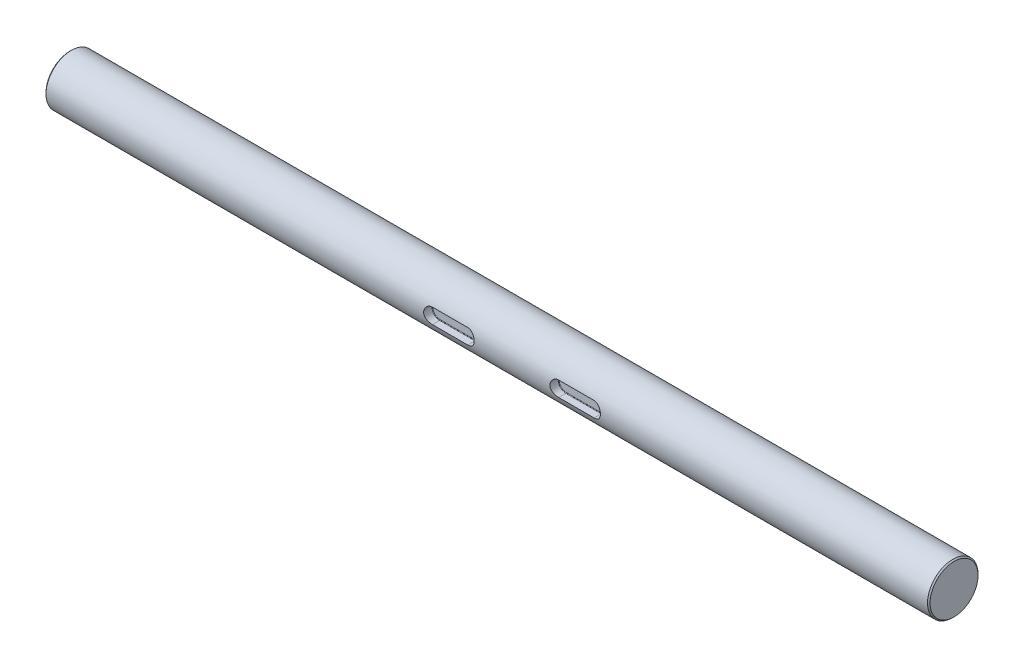
ISO-10303-21;
HEADER;
FILE_DESCRIPTION(('STEP AP214'),'2;1');
FILE_NAME('part.step','',(''),(''),'','','');
FILE_SCHEMA(('AUTOMOTIVE_DESIGN { 1 0 10303 214 1 1 1 1 }'));
ENDSEC;
DATA;
#1=APPLICATION_CONTEXT('core data for automotive mechanical design processes');
#2=APPLICATION_PROTOCOL_DEFINITION('international standard','automotive_design',2000,#1);
#3=PRODUCT_CONTEXT('',#1,'mechanical');
#4=PRODUCT('Part','Part','',(#3));
#5=PRODUCT_RELATED_PRODUCT_CATEGORY('part','',(#4));
#6=PRODUCT_DEFINITION_FORMATION('','',#4);
#7=PRODUCT_DEFINITION_CONTEXT('part definition',#1,'design');
#8=PRODUCT_DEFINITION('design','',#6,#7);
#9=PRODUCT_DEFINITION_SHAPE('','',#8);
#10=(LENGTH_UNIT() NAMED_UNIT(*) SI_UNIT(.MILLI.,.METRE.));
#11=(NAMED_UNIT(*) PLANE_ANGLE_UNIT() SI_UNIT($,.RADIAN.));
#12=(NAMED_UNIT(*) SI_UNIT($,.STERADIAN.) SOLID_ANGLE_UNIT());
#13=UNCERTAINTY_MEASURE_WITH_UNIT(LENGTH_MEASURE(1.E-05),#10,'distance_accuracy_value','');
#14=(GEOMETRIC_REPRESENTATION_CONTEXT(3) GLOBAL_UNCERTAINTY_ASSIGNED_CONTEXT((#13)) GLOBAL_UNIT_ASSIGNED_CONTEXT((#10,
#11,#12)) REPRESENTATION_CONTEXT('',''));
#15=CARTESIAN_POINT('',(0.,0.,0.));
#16=DIRECTION('',(0.,0.,1.));
#17=DIRECTION('',(1.,0.,0.));
#18=AXIS2_PLACEMENT_3D('',#15,#16,#17);
#19=CARTESIAN_POINT('',(0.,10.,0.));
#20=DIRECTION('',(1.,0.,0.));
#21=DIRECTION('',(0.,0.,-1.));
#22=AXIS2_PLACEMENT_3D('',#19,#20,#21);
#23=PLANE('',#22);
#24=CARTESIAN_POINT('',(0.,0.,0.));
#25=DIRECTION('',(1.,0.,0.));
#26=DIRECTION('',(0.,0.,-1.));
#27=AXIS2_PLACEMENT_3D('',#24,#25,#26);
#28=CIRCLE('',#27,9.49999999999998);
#29=CARTESIAN_POINT('',(0.,0.,-9.49999999999998));
#30=VERTEX_POINT('',#29);
#31=EDGE_CURVE('E205',#30,#30,#28,.F.);
#32=ORIENTED_EDGE('',*,*,#31,.T.);
#33=EDGE_LOOP('',(#32));
#34=FACE_BOUND('',#33,.T.);
#35=ADVANCED_FACE('F39',(#34),#23,.F.);
#36=CARTESIAN_POINT('',(350.,0.,0.));
#37=DIRECTION('',(-1.,0.,0.));
#38=DIRECTION('',(0.,0.,1.));
#39=AXIS2_PLACEMENT_3D('',#36,#37,#38);
#40=PLANE('',#39);
#41=CARTESIAN_POINT('',(350.,0.,0.));
#42=DIRECTION('',(-1.,0.,0.));
#43=DIRECTION('',(0.,0.,1.));
#44=AXIS2_PLACEMENT_3D('',#41,#42,#43);
#45=CIRCLE('',#44,9.49999999999998);
#46=CARTESIAN_POINT('',(350.,0.,9.49999999999998));
#47=VERTEX_POINT('',#46);
#48=EDGE_CURVE('E223',#47,#47,#45,.F.);
#49=ORIENTED_EDGE('',*,*,#48,.T.);
#50=EDGE_LOOP('',(#49));
#51=FACE_BOUND('',#50,.T.);
#52=ADVANCED_FACE('F277',(#51),#40,.F.);
#53=CARTESIAN_POINT('',(0.,0.,0.));
#54=DIRECTION('',(-1.,0.,0.));
#55=DIRECTION('',(0.,0.,1.));
#56=AXIS2_PLACEMENT_3D('',#53,#54,#55);
#57=CYLINDRICAL_SURFACE('',#56,9.99999999999999);
#58=DIRECTION('',(-1.,0.,0.));
#59=VECTOR('',#58,1.);
#60=CARTESIAN_POINT('',(0.,3.00000000000002,9.53939201416944));
#61=LINE('',#60,#59);
#62=CARTESIAN_POINT('',(203.,3.00000000000004,9.53939201416944));
#63=VERTEX_POINT('',#62);
#64=CARTESIAN_POINT('',(217.,3.00000000000002,9.53939201416944));
#65=VERTEX_POINT('',#64);
#66=EDGE_CURVE('E47',#63,#65,#61,.F.);
#67=ORIENTED_EDGE('',*,*,#66,.T.);
#68=CARTESIAN_POINT('',(217.,3.00000000000005,9.53939201416943));
#69=CARTESIAN_POINT('',(217.082335520823,3.00001027845732,9.53938054248204));
#70=CARTESIAN_POINT('',(217.164664455063,2.99661062684477,9.54045772064376));
#71=CARTESIAN_POINT('',(217.328693952765,2.98307142899352,9.54470412105984));
#72=CARTESIAN_POINT('',(217.410394653324,2.97293339805423,9.54787287296846));
#73=CARTESIAN_POINT('',(217.572384915673,2.9460314062505,9.55620668351001));
#74=CARTESIAN_POINT('',(217.652677524043,2.92928426957742,9.56136667250112));
#75=CARTESIAN_POINT('',(217.811475844134,2.88932853030399,9.57351626651176));
#76=CARTESIAN_POINT('',(217.889981509067,2.86611975872645,9.58050591937825));
#77=CARTESIAN_POINT('',(218.12194938799,2.78708584446028,9.60391637654134));
#78=CARTESIAN_POINT('',(218.272068438833,2.72181852542976,9.62279007830389));
#79=CARTESIAN_POINT('',(218.559226043979,2.56815043531279,9.66493213967817));
#80=CARTESIAN_POINT('',(218.696258470762,2.47973889924163,9.68820254290639));
#81=CARTESIAN_POINT('',(218.957722987948,2.27929879634446,9.73733650515373));
#82=CARTESIAN_POINT('',(219.081684874061,2.16666914746587,9.76325505469872));
#83=CARTESIAN_POINT('',(219.309273614839,1.92227736150436,9.81429628475076));
#84=CARTESIAN_POINT('',(219.412897033861,1.79051199848167,9.83941883019408));
#85=CARTESIAN_POINT('',(219.598926865095,1.50821997465699,9.88666477976533));
#86=CARTESIAN_POINT('',(219.680850179783,1.35736167401017,9.90871541546877));
#87=CARTESIAN_POINT('',(219.817977004003,1.04324233568303,9.94668940088143));
#88=CARTESIAN_POINT('',(219.873187403368,0.879984508687993,9.96261433032402));
#89=CARTESIAN_POINT('',(219.953759551791,0.550649404820611,9.98615279768397));
#90=CARTESIAN_POINT('',(219.979929703518,0.38478625301621,9.99399098526791));
#91=CARTESIAN_POINT('',(220.004234695146,0.0508471415689337,10.0012640407204));
#92=CARTESIAN_POINT('',(220.002374842678,-0.117228393125333,10.0007004995012));
#93=CARTESIAN_POINT('',(219.971214179309,-0.445143199271818,9.99139205125585));
#94=CARTESIAN_POINT('',(219.942789309192,-0.605074290763023,9.98290831016511));
#95=CARTESIAN_POINT('',(219.860736730374,-0.91778010437031,9.95903027401821));
#96=CARTESIAN_POINT('',(219.807107701317,-1.07055445110879,9.94363561692557));
#97=CARTESIAN_POINT('',(219.675575556475,-1.36669563173912,9.90730429851781));
#98=CARTESIAN_POINT('',(219.597396711224,-1.50993201207613,9.88630511384914));
#99=CARTESIAN_POINT('',(219.419202819966,-1.781531059161,9.84099249303646));
#100=CARTESIAN_POINT('',(219.319182881059,-1.90989038323251,9.81667831471805));
#101=CARTESIAN_POINT('',(219.095616023815,-2.15330901082205,9.76623347142779));
#102=CARTESIAN_POINT('',(218.971312272474,-2.26766702955975,9.74006890899096));
#103=CARTESIAN_POINT('',(218.705005153149,-2.47413538985067,9.68968430229326));
#104=CARTESIAN_POINT('',(218.56299663927,-2.5662392402618,9.66546482675133));
#105=CARTESIAN_POINT('',(218.2634381431,-2.72632814481701,9.62154457591302));
#106=CARTESIAN_POINT('',(218.105745640813,-2.79406012682262,9.60189192491895));
#107=CARTESIAN_POINT('',(217.780550992037,-2.90171772009404,9.56991327306402));
#108=CARTESIAN_POINT('',(217.613064278571,-2.94168586436072,9.55757606951749));
#109=CARTESIAN_POINT('',(217.37001022186,-2.97802407180158,9.54628064650011));
#110=CARTESIAN_POINT('',(217.296218531641,-2.98626405978017,9.54370312550533));
#111=CARTESIAN_POINT('',(217.148297041801,-2.99724711229708,9.54025857223563));
#112=CARTESIAN_POINT('',(217.074167900672,-2.99999825936537,9.53938902493287));
#113=CARTESIAN_POINT('',(217.,-3.,9.53939201416945));
#114=B_SPLINE_CURVE_WITH_KNOTS('',3,(#68,#69,#70,#71,#72,#73,#74,#75,#76,#77,#78,#79,#80,#81,
#82,#83,#84,#85,#86,#87,#88,#89,#90,#91,#92,#93,#94,#95,#96,#97,#98,#99,#100,#101,#102,#103,
#104,#105,#106,#107,#108,#109,#110,#111,#112,#113),.UNSPECIFIED.,.F.,.F.,(4,2,2,2,2,2,2,2,2,2,2,
2,2,2,2,2,2,2,2,2,2,2,4),(0.,0.246918142439474,0.49378077770608,0.740019009623012,
0.986263681482041,1.47813347402029,1.97023245590781,2.4763511982277,2.98255536239036,
3.49922810620076,4.01576751791677,4.51753600864769,5.01920948804106,5.50490358251098,
5.99062312360837,6.48200583350627,6.97349873739176,7.48389234847129,7.99443465298723,
8.51013494368219,9.02504345105582,9.24774267716781,9.47011372732398),.UNSPECIFIED.);
#115=CARTESIAN_POINT('',(217.,-2.99999999999999,9.53939201416944));
#116=VERTEX_POINT('',#115);
#117=EDGE_CURVE('E54',#65,#116,#114,.T.);
#118=ORIENTED_EDGE('',*,*,#117,.T.);
#119=DIRECTION('',(-1.,0.,0.));
#120=VECTOR('',#119,1.);
#121=CARTESIAN_POINT('',(0.,-3.00000000000002,9.53939201416944));
#122=LINE('',#121,#120);
#123=CARTESIAN_POINT('',(203.,-3.,9.53939201416944));
#124=VERTEX_POINT('',#123);
#125=EDGE_CURVE('E11',#116,#124,#122,.T.);
#126=ORIENTED_EDGE('',*,*,#125,.T.);
#127=CARTESIAN_POINT('',(203.,-3.,9.53939201416945));
#128=CARTESIAN_POINT('',(202.917664479177,-3.00001027845728,9.53938054248206));
#129=CARTESIAN_POINT('',(202.835335544937,-2.99661062684472,9.54045772064377));
#130=CARTESIAN_POINT('',(202.671306047235,-2.98307142899347,9.54470412105985));
#131=CARTESIAN_POINT('',(202.589605346676,-2.97293339805418,9.54787287296848));
#132=CARTESIAN_POINT('',(202.427615084327,-2.94603140625045,9.55620668351002));
#133=CARTESIAN_POINT('',(202.347322475957,-2.92928426957737,9.56136667250114));
#134=CARTESIAN_POINT('',(202.188524155866,-2.88932853030395,9.57351626651177));
#135=CARTESIAN_POINT('',(202.110018490933,-2.8661197587264,9.58050591937827));
#136=CARTESIAN_POINT('',(201.87805061201,-2.78708584446023,9.60391637654136));
#137=CARTESIAN_POINT('',(201.727931561167,-2.72181852542971,9.6227900783039));
#138=CARTESIAN_POINT('',(201.440773956021,-2.56815043531274,9.66493213967819));
#139=CARTESIAN_POINT('',(201.303741529238,-2.47973889924158,9.6882025429064));
#140=CARTESIAN_POINT('',(201.042277012052,-2.27929879634441,9.73733650515374));
#141=CARTESIAN_POINT('',(200.918315125939,-2.16666914746582,9.76325505469873));
#142=CARTESIAN_POINT('',(200.690726385161,-1.92227736150431,9.81429628475076));
#143=CARTESIAN_POINT('',(200.587102966139,-1.79051199848162,9.83941883019409));
#144=CARTESIAN_POINT('',(200.401073134905,-1.50821997465694,9.88666477976534));
#145=CARTESIAN_POINT('',(200.319149820217,-1.35736167401012,9.90871541546877));
#146=CARTESIAN_POINT('',(200.182022995997,-1.04324233568298,9.94668940088144));
#147=CARTESIAN_POINT('',(200.126812596632,-0.879984508687945,9.96261433032402));
#148=CARTESIAN_POINT('',(200.046240448209,-0.550649404820562,9.98615279768397));
#149=CARTESIAN_POINT('',(200.020070296482,-0.384786253016162,9.99399098526791));
#150=CARTESIAN_POINT('',(199.995765304854,-0.0508471415688855,10.0012640407204));
#151=CARTESIAN_POINT('',(199.997625157322,0.117228393125381,10.0007004995012));
#152=CARTESIAN_POINT('',(200.028785820691,0.445143199271866,9.99139205125585));
#153=CARTESIAN_POINT('',(200.057210690808,0.60507429076307,9.98290831016511));
#154=CARTESIAN_POINT('',(200.139263269626,0.917780104370356,9.95903027401821));
#155=CARTESIAN_POINT('',(200.192892298683,1.07055445110883,9.94363561692557));
#156=CARTESIAN_POINT('',(200.324424443525,1.36669563173916,9.9073042985178));
#157=CARTESIAN_POINT('',(200.402603288776,1.50993201207617,9.88630511384913));
#158=CARTESIAN_POINT('',(200.580797180034,1.78153105916105,9.84099249303645));
#159=CARTESIAN_POINT('',(200.680817118941,1.90989038323255,9.81667831471804));
#160=CARTESIAN_POINT('',(200.904383976185,2.1533090108221,9.76623347142778));
#161=CARTESIAN_POINT('',(201.028687727526,2.2676670295598,9.74006890899095));
#162=CARTESIAN_POINT('',(201.294994846851,2.47413538985072,9.68968430229325));
#163=CARTESIAN_POINT('',(201.43700336073,2.56623924026185,9.66546482675131));
#164=CARTESIAN_POINT('',(201.7365618569,2.72632814481706,9.62154457591301));
#165=CARTESIAN_POINT('',(201.894254359187,2.79406012682267,9.60189192491893));
#166=CARTESIAN_POINT('',(202.219449007963,2.90171772009409,9.569913273064));
#167=CARTESIAN_POINT('',(202.386935721429,2.94168586436077,9.55757606951747));
#168=CARTESIAN_POINT('',(202.62998977814,2.97802407180163,9.54628064650009));
#169=CARTESIAN_POINT('',(202.703781468359,2.98626405978022,9.54370312550531));
#170=CARTESIAN_POINT('',(202.851702958199,2.99724711229713,9.54025857223562));
#171=CARTESIAN_POINT('',(202.925832099328,2.99999825936542,9.53938902493285));
#172=CARTESIAN_POINT('',(203.,3.00000000000005,9.53939201416943));
#173=B_SPLINE_CURVE_WITH_KNOTS('',3,(#127,#128,#129,#130,#131,#132,#133,#134,#135,#136,#137,
#138,#139,#140,#141,#142,#143,#144,#145,#146,#147,#148,#149,#150,#151,#152,#153,#154,#155,#156,
#157,#158,#159,#160,#161,#162,#163,#164,#165,#166,#167,#168,#169,#170,#171,#172),.UNSPECIFIED.,
.F.,.F.,(4,2,2,2,2,2,2,2,2,2,2,2,2,2,2,2,2,2,2,2,2,2,4),(0.,0.246918142439474,0.49378077770608,
0.740019009623012,0.986263681482041,1.47813347402029,1.97023245590781,2.4763511982277,
2.98255536239036,3.49922810620076,4.01576751791677,4.51753600864769,5.01920948804106,
5.50490358251098,5.99062312360837,6.48200583350627,6.97349873739176,7.48389234847129,
7.99443465298722,8.51013494368219,9.02504345105582,9.24774267716787,9.47011372732398),.UNSPECIFIED.);
#174=EDGE_CURVE('E311',#124,#63,#173,.T.);
#175=ORIENTED_EDGE('',*,*,#174,.T.);
#176=EDGE_LOOP('',(#67,#118,#126,#175));
#177=FACE_BOUND('',#176,.T.);
#178=DIRECTION('',(-1.,0.,0.));
#179=VECTOR('',#178,1.);
#180=CARTESIAN_POINT('',(0.,2.99999999999998,9.53939201416945));
#181=LINE('',#180,#179);
#182=CARTESIAN_POINT('',(153.,3.,9.53939201416945));
#183=VERTEX_POINT('',#182);
#184=CARTESIAN_POINT('',(167.,2.99999999999998,9.53939201416945));
#185=VERTEX_POINT('',#184);
#186=EDGE_CURVE('E306',#183,#185,#181,.F.);
#187=ORIENTED_EDGE('',*,*,#186,.T.);
#188=CARTESIAN_POINT('',(167.,3.,9.53939201416945));
#189=CARTESIAN_POINT('',(167.082335520823,3.00001027845728,9.53938054248206));
#190=CARTESIAN_POINT('',(167.164664455063,2.99661062684472,9.54045772064378));
#191=CARTESIAN_POINT('',(167.328693952765,2.98307142899347,9.54470412105985));
#192=CARTESIAN_POINT('',(167.410394653324,2.97293339805418,9.54787287296848));
#193=CARTESIAN_POINT('',(167.572384915673,2.94603140625045,9.55620668351002));
#194=CARTESIAN_POINT('',(167.652677524043,2.92928426957737,9.56136667250113));
#195=CARTESIAN_POINT('',(167.811475844134,2.88932853030395,9.57351626651177));
#196=CARTESIAN_POINT('',(167.889981509067,2.86611975872641,9.58050591937826));
#197=CARTESIAN_POINT('',(168.12194938799,2.78708584446025,9.60391637654135));
#198=CARTESIAN_POINT('',(168.272068438833,2.72181852542973,9.6227900783039));
#199=CARTESIAN_POINT('',(168.559226043979,2.56815043531277,9.66493213967818));
#200=CARTESIAN_POINT('',(168.696258470762,2.4797388992416,9.6882025429064));
#201=CARTESIAN_POINT('',(168.957722987948,2.27929879634443,9.73733650515373));
#202=CARTESIAN_POINT('',(169.081684874061,2.16666914746584,9.76325505469873));
#203=CARTESIAN_POINT('',(169.309273614839,1.92227736150433,9.81429628475076));
#204=CARTESIAN_POINT('',(169.412897033861,1.79051199848164,9.83941883019409));
#205=CARTESIAN_POINT('',(169.598926865095,1.50821997465697,9.88666477976533));
#206=CARTESIAN_POINT('',(169.680850179783,1.35736167401016,9.90871541546877));
#207=CARTESIAN_POINT('',(169.817977004003,1.04324233568303,9.94668940088143));
#208=CARTESIAN_POINT('',(169.873187403368,0.879984508687987,9.96261433032402));
#209=CARTESIAN_POINT('',(169.953759551791,0.550649404820607,9.98615279768397));
#210=CARTESIAN_POINT('',(169.979929703518,0.384786253016208,9.99399098526791));
#211=CARTESIAN_POINT('',(170.004234695146,0.0508471415689356,10.0012640407204));
#212=CARTESIAN_POINT('',(170.002374842678,-0.117228393125329,10.0007004995012));
#213=CARTESIAN_POINT('',(169.971214179309,-0.445143199271811,9.99139205125585));
#214=CARTESIAN_POINT('',(169.942789309192,-0.605074290763014,9.98290831016511));
#215=CARTESIAN_POINT('',(169.860736730374,-0.917780104370299,9.95903027401822));
#216=CARTESIAN_POINT('',(169.807107701317,-1.07055445110878,9.94363561692557));
#217=CARTESIAN_POINT('',(169.675575556475,-1.3666956317391,9.90730429851781));
#218=CARTESIAN_POINT('',(169.597396711224,-1.50993201207611,9.88630511384914));
#219=CARTESIAN_POINT('',(169.419202819966,-1.78153105916099,9.84099249303646));
#220=CARTESIAN_POINT('',(169.319182881059,-1.90989038323249,9.81667831471805));
#221=CARTESIAN_POINT('',(169.095616023815,-2.15330901082204,9.76623347142779));
#222=CARTESIAN_POINT('',(168.971312272474,-2.26766702955975,9.74006890899096));
#223=CARTESIAN_POINT('',(168.705005153149,-2.47413538985067,9.68968430229326));
#224=CARTESIAN_POINT('',(168.56299663927,-2.5662392402618,9.66546482675133));
#225=CARTESIAN_POINT('',(168.2634381431,-2.72632814481701,9.62154457591302));
#226=CARTESIAN_POINT('',(168.105745640813,-2.79406012682262,9.60189192491895));
#227=CARTESIAN_POINT('',(167.780550992037,-2.90171772009404,9.56991327306402));
#228=CARTESIAN_POINT('',(167.613064278571,-2.94168586436072,9.55757606951749));
#229=CARTESIAN_POINT('',(167.37001022186,-2.97802407180158,9.54628064650011));
#230=CARTESIAN_POINT('',(167.296218531641,-2.98626405978017,9.54370312550533));
#231=CARTESIAN_POINT('',(167.148297041801,-2.99724711229708,9.54025857223563));
#232=CARTESIAN_POINT('',(167.074167900672,-2.99999825936538,9.53938902493287));
#233=CARTESIAN_POINT('',(167.,-3.,9.53939201416945));
#234=B_SPLINE_CURVE_WITH_KNOTS('',3,(#188,#189,#190,#191,#192,#193,#194,#195,#196,#197,#198,
#199,#200,#201,#202,#203,#204,#205,#206,#207,#208,#209,#210,#211,#212,#213,#214,#215,#216,#217,
#218,#219,#220,#221,#222,#223,#224,#225,#226,#227,#228,#229,#230,#231,#232,#233),.UNSPECIFIED.,
.F.,.F.,(4,2,2,2,2,2,2,2,2,2,2,2,2,2,2,2,2,2,2,2,2,2,4),(0.,0.246918142439474,0.49378077770608,
0.740019009623012,0.986263681482012,1.47813347402023,1.97023245590778,2.47635119822767,
2.98255536239032,3.4992281062007,4.01576751791672,4.51753600864763,5.019209488041,
5.5049035825109,5.9906231236083,6.48200583350619,6.97349873739168,7.48389234847122,
7.99443465298715,8.51013494368212,9.02504345105572,9.24774267716774,9.47011372732391),.UNSPECIFIED.);
#235=CARTESIAN_POINT('',(167.,-3.,9.53939201416944));
#236=VERTEX_POINT('',#235);
#237=EDGE_CURVE('E62',#185,#236,#234,.T.);
#238=ORIENTED_EDGE('',*,*,#237,.T.);
#239=DIRECTION('',(-1.,0.,0.));
#240=VECTOR('',#239,1.);
#241=CARTESIAN_POINT('',(0.,-3.00000000000002,9.53939201416944));
#242=LINE('',#241,#240);
#243=CARTESIAN_POINT('',(153.,-3.,9.53939201416944));
#244=VERTEX_POINT('',#243);
#245=EDGE_CURVE('E310',#236,#244,#242,.T.);
#246=ORIENTED_EDGE('',*,*,#245,.T.);
#247=CARTESIAN_POINT('',(153.,-3.,9.53939201416945));
#248=CARTESIAN_POINT('',(152.917664479177,-3.00001027845728,9.53938054248206));
#249=CARTESIAN_POINT('',(152.835335544937,-2.99661062684473,9.54045772064377));
#250=CARTESIAN_POINT('',(152.671306047235,-2.98307142899347,9.54470412105985));
#251=CARTESIAN_POINT('',(152.589605346676,-2.97293339805419,9.54787287296848));
#252=CARTESIAN_POINT('',(152.427615084327,-2.94603140625045,9.55620668351002));
#253=CARTESIAN_POINT('',(152.347322475957,-2.92928426957738,9.56136667250113));
#254=CARTESIAN_POINT('',(152.188524155866,-2.88932853030395,9.57351626651177));
#255=CARTESIAN_POINT('',(152.110018490933,-2.86611975872641,9.58050591937826));
#256=CARTESIAN_POINT('',(151.87805061201,-2.78708584446025,9.60391637654135));
#257=CARTESIAN_POINT('',(151.727931561167,-2.72181852542973,9.62279007830389));
#258=CARTESIAN_POINT('',(151.440773956021,-2.56815043531277,9.66493213967818));
#259=CARTESIAN_POINT('',(151.303741529238,-2.47973889924161,9.6882025429064));
#260=CARTESIAN_POINT('',(151.042277012052,-2.27929879634443,9.73733650515373));
#261=CARTESIAN_POINT('',(150.918315125939,-2.16666914746584,9.76325505469872));
#262=CARTESIAN_POINT('',(150.690726385161,-1.92227736150434,9.81429628475076));
#263=CARTESIAN_POINT('',(150.587102966139,-1.79051199848164,9.83941883019409));
#264=CARTESIAN_POINT('',(150.401073134905,-1.50821997465698,9.88666477976533));
#265=CARTESIAN_POINT('',(150.319149820217,-1.35736167401016,9.90871541546877));
#266=CARTESIAN_POINT('',(150.182022995997,-1.04324233568303,9.94668940088143));
#267=CARTESIAN_POINT('',(150.126812596632,-0.87998450868799,9.96261433032402));
#268=CARTESIAN_POINT('',(150.046240448209,-0.550649404820608,9.98615279768397));
#269=CARTESIAN_POINT('',(150.020070296482,-0.384786253016209,9.99399098526791));
#270=CARTESIAN_POINT('',(149.995765304854,-0.0508471415689361,10.0012640407204));
#271=CARTESIAN_POINT('',(149.997625157322,0.117228393125328,10.0007004995012));
#272=CARTESIAN_POINT('',(150.028785820691,0.445143199271809,9.99139205125585));
#273=CARTESIAN_POINT('',(150.057210690808,0.605074290763012,9.98290831016511));
#274=CARTESIAN_POINT('',(150.139263269625,0.917780104370297,9.95903027401822));
#275=CARTESIAN_POINT('',(150.192892298683,1.07055445110877,9.94363561692557));
#276=CARTESIAN_POINT('',(150.324424443525,1.3666956317391,9.90730429851781));
#277=CARTESIAN_POINT('',(150.402603288776,1.50993201207611,9.88630511384914));
#278=CARTESIAN_POINT('',(150.580797180034,1.78153105916099,9.84099249303646));
#279=CARTESIAN_POINT('',(150.680817118941,1.90989038323249,9.81667831471805));
#280=CARTESIAN_POINT('',(150.904383976185,2.15330901082204,9.76623347142779));
#281=CARTESIAN_POINT('',(151.028687727526,2.26766702955974,9.74006890899096));
#282=CARTESIAN_POINT('',(151.294994846851,2.47413538985066,9.68968430229326));
#283=CARTESIAN_POINT('',(151.43700336073,2.5662392402618,9.66546482675133));
#284=CARTESIAN_POINT('',(151.7365618569,2.72632814481701,9.62154457591302));
#285=CARTESIAN_POINT('',(151.894254359187,2.79406012682262,9.60189192491895));
#286=CARTESIAN_POINT('',(152.219449007963,2.90171772009404,9.56991327306402));
#287=CARTESIAN_POINT('',(152.386935721429,2.94168586436072,9.55757606951749));
#288=CARTESIAN_POINT('',(152.62998977814,2.97802407180158,9.54628064650011));
#289=CARTESIAN_POINT('',(152.703781468359,2.98626405978017,9.54370312550532));
#290=CARTESIAN_POINT('',(152.851702958199,2.99724711229708,9.54025857223563));
#291=CARTESIAN_POINT('',(152.925832099328,2.99999825936537,9.53938902493287));
#292=CARTESIAN_POINT('',(153.,3.,9.53939201416945));
#293=B_SPLINE_CURVE_WITH_KNOTS('',3,(#247,#248,#249,#250,#251,#252,#253,#254,#255,#256,#257,
#258,#259,#260,#261,#262,#263,#264,#265,#266,#267,#268,#269,#270,#271,#272,#273,#274,#275,#276,
#277,#278,#279,#280,#281,#282,#283,#284,#285,#286,#287,#288,#289,#290,#291,#292),.UNSPECIFIED.,
.F.,.F.,(4,2,2,2,2,2,2,2,2,2,2,2,2,2,2,2,2,2,2,2,2,2,4),(0.,0.246918142439474,0.49378077770608,
0.740019009622984,0.986263681482012,1.47813347402023,1.97023245590778,2.47635119822767,
2.98255536239032,3.4992281062007,4.01576751791672,4.51753600864763,5.019209488041,
5.50490358251091,5.9906231236083,6.48200583350619,6.97349873739168,7.48389234847122,
7.99443465298715,8.51013494368212,9.02504345105572,9.2477426771678,9.47011372732391),.UNSPECIFIED.);
#294=EDGE_CURVE('E226',#244,#183,#293,.T.);
#295=ORIENTED_EDGE('',*,*,#294,.T.);
#296=EDGE_LOOP('',(#187,#238,#246,#295));
#297=FACE_BOUND('',#296,.T.);
#298=CARTESIAN_POINT('',(0.500000000000018,0.,0.));
#299=DIRECTION('',(1.,0.,0.));
#300=DIRECTION('',(0.,0.,-1.));
#301=AXIS2_PLACEMENT_3D('',#298,#299,#300);
#302=CIRCLE('',#301,9.99999999999999);
#303=CARTESIAN_POINT('',(0.500000000000018,0.,-9.99999999999999));
#304=VERTEX_POINT('',#303);
#305=EDGE_CURVE('E220',#304,#304,#302,.T.);
#306=ORIENTED_EDGE('',*,*,#305,.T.);
#307=EDGE_LOOP('',(#306));
#308=FACE_BOUND('',#307,.T.);
#309=CARTESIAN_POINT('',(349.5,0.,0.));
#310=DIRECTION('',(-1.,0.,0.));
#311=DIRECTION('',(0.,0.,1.));
#312=AXIS2_PLACEMENT_3D('',#309,#310,#311);
#313=CIRCLE('',#312,9.99999999999999);
#314=CARTESIAN_POINT('',(349.5,0.,9.99999999999999));
#315=VERTEX_POINT('',#314);
#316=EDGE_CURVE('E217',#315,#315,#313,.T.);
#317=ORIENTED_EDGE('',*,*,#316,.T.);
#318=EDGE_LOOP('',(#317));
#319=FACE_BOUND('',#318,.T.);
#320=ADVANCED_FACE('F239',(#177,#297,#308,#319),#57,.T.);
#321=CARTESIAN_POINT('',(0.,0.,0.));
#322=DIRECTION('',(1.,0.,0.));
#323=DIRECTION('',(0.,0.,-1.));
#324=AXIS2_PLACEMENT_3D('',#321,#322,#323);
#325=CONICAL_SURFACE('',#324,9.49999999999998,0.785398163397441);
#326=ORIENTED_EDGE('',*,*,#305,.F.);
#327=EDGE_LOOP('',(#326));
#328=FACE_BOUND('',#327,.T.);
#329=ORIENTED_EDGE('',*,*,#31,.F.);
#330=EDGE_LOOP('',(#329));
#331=FACE_BOUND('',#330,.T.);
#332=ADVANCED_FACE('F284',(#328,#331),#325,.T.);
#333=CARTESIAN_POINT('',(349.5,0.,0.));
#334=DIRECTION('',(-1.,0.,0.));
#335=DIRECTION('',(0.,0.,1.));
#336=AXIS2_PLACEMENT_3D('',#333,#334,#335);
#337=CONICAL_SURFACE('',#336,9.99999999999999,0.785398163397403);
#338=ORIENTED_EDGE('',*,*,#48,.F.);
#339=EDGE_LOOP('',(#338));
#340=FACE_BOUND('',#339,.T.);
#341=ORIENTED_EDGE('',*,*,#316,.F.);
#342=EDGE_LOOP('',(#341));
#343=FACE_BOUND('',#342,.T.);
#344=ADVANCED_FACE('F41',(#340,#343),#337,.T.);
#345=CARTESIAN_POINT('',(167.,0.,10.));
#346=DIRECTION('',(0.,0.,1.));
#347=DIRECTION('',(1.,0.,0.));
#348=AXIS2_PLACEMENT_3D('',#345,#346,#347);
#349=CYLINDRICAL_SURFACE('',#348,3.);
#350=DIRECTION('',(0.,0.,1.));
#351=VECTOR('',#350,1.);
#352=CARTESIAN_POINT('',(167.,3.,6.5));
#353=LINE('',#352,#351);
#354=CARTESIAN_POINT('',(167.,3.,6.7));
#355=VERTEX_POINT('',#354);
#356=EDGE_CURVE('E182',#185,#355,#353,.F.);
#357=ORIENTED_EDGE('',*,*,#356,.T.);
#358=CARTESIAN_POINT('',(167.,0.,6.7));
#359=DIRECTION('',(0.,0.,-1.));
#360=DIRECTION('',(-1.,0.,0.));
#361=AXIS2_PLACEMENT_3D('',#358,#359,#360);
#362=CIRCLE('',#361,3.);
#363=CARTESIAN_POINT('',(167.,-3.,6.7));
#364=VERTEX_POINT('',#363);
#365=EDGE_CURVE('E200',#364,#355,#362,.F.);
#366=ORIENTED_EDGE('',*,*,#365,.F.);
#367=DIRECTION('',(0.,0.,1.));
#368=VECTOR('',#367,1.);
#369=CARTESIAN_POINT('',(167.,-3.,6.5));
#370=LINE('',#369,#368);
#371=EDGE_CURVE('E184',#364,#236,#370,.T.);
#372=ORIENTED_EDGE('',*,*,#371,.T.);
#373=ORIENTED_EDGE('',*,*,#237,.F.);
#374=EDGE_LOOP('',(#357,#366,#372,#373));
#375=FACE_BOUND('',#374,.T.);
#376=ADVANCED_FACE('F248',(#375),#349,.F.);
#377=CARTESIAN_POINT('',(153.,0.,6.5));
#378=DIRECTION('',(0.,0.,1.));
#379=DIRECTION('',(1.,0.,0.));
#380=AXIS2_PLACEMENT_3D('',#377,#378,#379);
#381=CYLINDRICAL_SURFACE('',#380,3.);
#382=DIRECTION('',(0.,0.,1.));
#383=VECTOR('',#382,1.);
#384=CARTESIAN_POINT('',(153.,-3.,6.5));
#385=LINE('',#384,#383);
#386=CARTESIAN_POINT('',(153.,-3.,6.7));
#387=VERTEX_POINT('',#386);
#388=EDGE_CURVE('E179',#244,#387,#385,.F.);
#389=ORIENTED_EDGE('',*,*,#388,.T.);
#390=CARTESIAN_POINT('',(153.,0.,6.7));
#391=DIRECTION('',(0.,0.,-1.));
#392=DIRECTION('',(-1.,0.,0.));
#393=AXIS2_PLACEMENT_3D('',#390,#391,#392);
#394=CIRCLE('',#393,3.);
#395=CARTESIAN_POINT('',(153.,3.,6.7));
#396=VERTEX_POINT('',#395);
#397=EDGE_CURVE('E195',#396,#387,#394,.F.);
#398=ORIENTED_EDGE('',*,*,#397,.F.);
#399=DIRECTION('',(0.,0.,1.));
#400=VECTOR('',#399,1.);
#401=CARTESIAN_POINT('',(153.,3.,6.5));
#402=LINE('',#401,#400);
#403=EDGE_CURVE('E176',#396,#183,#402,.T.);
#404=ORIENTED_EDGE('',*,*,#403,.T.);
#405=ORIENTED_EDGE('',*,*,#294,.F.);
#406=EDGE_LOOP('',(#389,#398,#404,#405));
#407=FACE_BOUND('',#406,.T.);
#408=ADVANCED_FACE('F243',(#407),#381,.F.);
#409=CARTESIAN_POINT('',(150.,-3.,6.5));
#410=DIRECTION('',(0.,-1.,0.));
#411=DIRECTION('',(1.,0.,0.));
#412=AXIS2_PLACEMENT_3D('',#409,#410,#411);
#413=PLANE('',#412);
#414=ORIENTED_EDGE('',*,*,#371,.F.);
#415=DIRECTION('',(1.,0.,0.));
#416=VECTOR('',#415,1.);
#417=CARTESIAN_POINT('',(150.,-3.,6.7));
#418=LINE('',#417,#416);
#419=EDGE_CURVE('E198',#387,#364,#418,.T.);
#420=ORIENTED_EDGE('',*,*,#419,.F.);
#421=ORIENTED_EDGE('',*,*,#388,.F.);
#422=ORIENTED_EDGE('',*,*,#245,.F.);
#423=EDGE_LOOP('',(#414,#420,#421,#422));
#424=FACE_BOUND('',#423,.T.);
#425=ADVANCED_FACE('F247',(#424),#413,.F.);
#426=CARTESIAN_POINT('',(150.,2.99999999999999,6.5));
#427=DIRECTION('',(0.,1.,0.));
#428=DIRECTION('',(-1.,0.,0.));
#429=AXIS2_PLACEMENT_3D('',#426,#427,#428);
#430=PLANE('',#429);
#431=ORIENTED_EDGE('',*,*,#403,.F.);
#432=DIRECTION('',(-1.,0.,0.));
#433=VECTOR('',#432,1.);
#434=CARTESIAN_POINT('',(150.,2.99999999999999,6.7));
#435=LINE('',#434,#433);
#436=EDGE_CURVE('E203',#355,#396,#435,.T.);
#437=ORIENTED_EDGE('',*,*,#436,.F.);
#438=ORIENTED_EDGE('',*,*,#356,.F.);
#439=ORIENTED_EDGE('',*,*,#186,.F.);
#440=EDGE_LOOP('',(#431,#437,#438,#439));
#441=FACE_BOUND('',#440,.T.);
#442=ADVANCED_FACE('F273',(#441),#430,.F.);
#443=CARTESIAN_POINT('',(0.,0.,6.5));
#444=DIRECTION('',(0.,0.,-1.));
#445=DIRECTION('',(-1.,0.,0.));
#446=AXIS2_PLACEMENT_3D('',#443,#444,#445);
#447=PLANE('',#446);
#448=DIRECTION('',(1.,0.,0.));
#449=VECTOR('',#448,1.);
#450=CARTESIAN_POINT('',(0.,-2.80000000000002,6.5));
#451=LINE('',#450,#449);
#452=CARTESIAN_POINT('',(167.,-2.8,6.5));
#453=VERTEX_POINT('',#452);
#454=CARTESIAN_POINT('',(153.,-2.8,6.5));
#455=VERTEX_POINT('',#454);
#456=EDGE_CURVE('E190',#453,#455,#451,.F.);
#457=ORIENTED_EDGE('',*,*,#456,.F.);
#458=CARTESIAN_POINT('',(167.,0.,6.5));
#459=DIRECTION('',(0.,0.,-1.));
#460=DIRECTION('',(-1.,0.,0.));
#461=AXIS2_PLACEMENT_3D('',#458,#459,#460);
#462=CIRCLE('',#461,2.8);
#463=CARTESIAN_POINT('',(167.,2.8,6.5));
#464=VERTEX_POINT('',#463);
#465=EDGE_CURVE('E188',#464,#453,#462,.T.);
#466=ORIENTED_EDGE('',*,*,#465,.F.);
#467=DIRECTION('',(-1.,0.,0.));
#468=VECTOR('',#467,1.);
#469=CARTESIAN_POINT('',(0.,2.79999999999998,6.5));
#470=LINE('',#469,#468);
#471=CARTESIAN_POINT('',(153.,2.8,6.5));
#472=VERTEX_POINT('',#471);
#473=EDGE_CURVE('E186',#472,#464,#470,.F.);
#474=ORIENTED_EDGE('',*,*,#473,.F.);
#475=CARTESIAN_POINT('',(153.,0.,6.5));
#476=DIRECTION('',(0.,0.,-1.));
#477=DIRECTION('',(-1.,0.,0.));
#478=AXIS2_PLACEMENT_3D('',#475,#476,#477);
#479=CIRCLE('',#478,2.8);
#480=EDGE_CURVE('E192',#455,#472,#479,.T.);
#481=ORIENTED_EDGE('',*,*,#480,.F.);
#482=EDGE_LOOP('',(#457,#466,#474,#481));
#483=FACE_BOUND('',#482,.T.);
#484=ADVANCED_FACE('F268',(#483),#447,.F.);
#485=CARTESIAN_POINT('',(167.,0.,6.7));
#486=DIRECTION('',(0.,0.,-1.));
#487=DIRECTION('',(-1.,0.,0.));
#488=AXIS2_PLACEMENT_3D('',#485,#486,#487);
#489=TOROIDAL_SURFACE('',#488,2.8,0.2);
#490=CARTESIAN_POINT('',(167.,2.8,6.7));
#491=DIRECTION('',(-1.,0.,0.));
#492=DIRECTION('',(0.,0.,1.));
#493=AXIS2_PLACEMENT_3D('',#490,#491,#492);
#494=CIRCLE('',#493,0.2);
#495=EDGE_CURVE('E210',#355,#464,#494,.T.);
#496=ORIENTED_EDGE('',*,*,#495,.T.);
#497=ORIENTED_EDGE('',*,*,#465,.T.);
#498=CARTESIAN_POINT('',(167.,-2.8,6.7));
#499=DIRECTION('',(-1.,0.,0.));
#500=DIRECTION('',(0.,0.,1.));
#501=AXIS2_PLACEMENT_3D('',#498,#499,#500);
#502=CIRCLE('',#501,0.2);
#503=EDGE_CURVE('E180',#453,#364,#502,.T.);
#504=ORIENTED_EDGE('',*,*,#503,.T.);
#505=ORIENTED_EDGE('',*,*,#365,.T.);
#506=EDGE_LOOP('',(#496,#497,#504,#505));
#507=FACE_BOUND('',#506,.T.);
#508=ADVANCED_FACE('F265',(#507),#489,.F.);
#509=CARTESIAN_POINT('',(150.,-2.8,6.7));
#510=DIRECTION('',(1.,0.,0.));
#511=DIRECTION('',(0.,1.,0.));
#512=AXIS2_PLACEMENT_3D('',#509,#510,#511);
#513=CYLINDRICAL_SURFACE('',#512,0.2);
#514=ORIENTED_EDGE('',*,*,#503,.F.);
#515=ORIENTED_EDGE('',*,*,#456,.T.);
#516=CARTESIAN_POINT('',(153.,-2.8,6.7));
#517=DIRECTION('',(-1.,0.,0.));
#518=DIRECTION('',(0.,0.,1.));
#519=AXIS2_PLACEMENT_3D('',#516,#517,#518);
#520=CIRCLE('',#519,0.2);
#521=EDGE_CURVE('E207',#455,#387,#520,.T.);
#522=ORIENTED_EDGE('',*,*,#521,.T.);
#523=ORIENTED_EDGE('',*,*,#419,.T.);
#524=EDGE_LOOP('',(#514,#515,#522,#523));
#525=FACE_BOUND('',#524,.T.);
#526=ADVANCED_FACE('F262',(#525),#513,.F.);
#527=CARTESIAN_POINT('',(150.,2.79999999999999,6.7));
#528=DIRECTION('',(-1.,0.,0.));
#529=DIRECTION('',(0.,-1.,0.));
#530=AXIS2_PLACEMENT_3D('',#527,#528,#529);
#531=CYLINDRICAL_SURFACE('',#530,0.2);
#532=ORIENTED_EDGE('',*,*,#495,.F.);
#533=ORIENTED_EDGE('',*,*,#436,.T.);
#534=CARTESIAN_POINT('',(153.,2.8,6.7));
#535=DIRECTION('',(-1.,0.,0.));
#536=DIRECTION('',(0.,0.,1.));
#537=AXIS2_PLACEMENT_3D('',#534,#535,#536);
#538=CIRCLE('',#537,0.2);
#539=EDGE_CURVE('E167',#396,#472,#538,.T.);
#540=ORIENTED_EDGE('',*,*,#539,.T.);
#541=ORIENTED_EDGE('',*,*,#473,.T.);
#542=EDGE_LOOP('',(#532,#533,#540,#541));
#543=FACE_BOUND('',#542,.T.);
#544=ADVANCED_FACE('F258',(#543),#531,.F.);
#545=CARTESIAN_POINT('',(153.,0.,6.7));
#546=DIRECTION('',(0.,0.,-1.));
#547=DIRECTION('',(-1.,0.,0.));
#548=AXIS2_PLACEMENT_3D('',#545,#546,#547);
#549=TOROIDAL_SURFACE('',#548,2.8,0.2);
#550=ORIENTED_EDGE('',*,*,#521,.F.);
#551=ORIENTED_EDGE('',*,*,#480,.T.);
#552=ORIENTED_EDGE('',*,*,#539,.F.);
#553=ORIENTED_EDGE('',*,*,#397,.T.);
#554=EDGE_LOOP('',(#550,#551,#552,#553));
#555=FACE_BOUND('',#554,.T.);
#556=ADVANCED_FACE('F254',(#555),#549,.F.);
#557=CARTESIAN_POINT('',(217.,0.,10.));
#558=DIRECTION('',(0.,0.,1.));
#559=DIRECTION('',(1.,0.,0.));
#560=AXIS2_PLACEMENT_3D('',#557,#558,#559);
#561=CYLINDRICAL_SURFACE('',#560,3.00000000000002);
#562=DIRECTION('',(0.,0.,1.));
#563=VECTOR('',#562,1.);
#564=CARTESIAN_POINT('',(217.,3.00000000000004,6.5));
#565=LINE('',#564,#563);
#566=CARTESIAN_POINT('',(217.,3.00000000000004,6.7));
#567=VERTEX_POINT('',#566);
#568=EDGE_CURVE('E525',#65,#567,#565,.F.);
#569=ORIENTED_EDGE('',*,*,#568,.T.);
#570=CARTESIAN_POINT('',(217.,0.,6.7));
#571=DIRECTION('',(0.,0.,1.));
#572=DIRECTION('',(1.,0.,0.));
#573=AXIS2_PLACEMENT_3D('',#570,#571,#572);
#574=CIRCLE('',#573,3.00000000000002);
#575=CARTESIAN_POINT('',(217.,-2.99999999999999,6.7));
#576=VERTEX_POINT('',#575);
#577=EDGE_CURVE('E164',#576,#567,#574,.T.);
#578=ORIENTED_EDGE('',*,*,#577,.F.);
#579=DIRECTION('',(0.,0.,1.));
#580=VECTOR('',#579,1.);
#581=CARTESIAN_POINT('',(217.,-2.99999999999999,6.5));
#582=LINE('',#581,#580);
#583=EDGE_CURVE('E150',#576,#116,#582,.T.);
#584=ORIENTED_EDGE('',*,*,#583,.T.);
#585=ORIENTED_EDGE('',*,*,#117,.F.);
#586=EDGE_LOOP('',(#569,#578,#584,#585));
#587=FACE_BOUND('',#586,.T.);
#588=ADVANCED_FACE('F257',(#587),#561,.F.);
#589=CARTESIAN_POINT('',(203.,0.,6.5));
#590=DIRECTION('',(0.,0.,1.));
#591=DIRECTION('',(1.,0.,0.));
#592=AXIS2_PLACEMENT_3D('',#589,#590,#591);
#593=CYLINDRICAL_SURFACE('',#592,3.00000000000002);
#594=DIRECTION('',(0.,0.,1.));
#595=VECTOR('',#594,1.);
#596=CARTESIAN_POINT('',(203.,-3.,6.5));
#597=LINE('',#596,#595);
#598=CARTESIAN_POINT('',(203.,-3.,6.7));
#599=VERTEX_POINT('',#598);
#600=EDGE_CURVE('E521',#124,#599,#597,.F.);
#601=ORIENTED_EDGE('',*,*,#600,.T.);
#602=CARTESIAN_POINT('',(203.,0.,6.7));
#603=DIRECTION('',(0.,0.,1.));
#604=DIRECTION('',(1.,0.,0.));
#605=AXIS2_PLACEMENT_3D('',#602,#603,#604);
#606=CIRCLE('',#605,3.00000000000002);
#607=CARTESIAN_POINT('',(203.,3.00000000000004,6.7));
#608=VERTEX_POINT('',#607);
#609=EDGE_CURVE('E155',#608,#599,#606,.T.);
#610=ORIENTED_EDGE('',*,*,#609,.F.);
#611=DIRECTION('',(0.,0.,1.));
#612=VECTOR('',#611,1.);
#613=CARTESIAN_POINT('',(203.,3.00000000000004,6.5));
#614=LINE('',#613,#612);
#615=EDGE_CURVE('E175',#608,#63,#614,.T.);
#616=ORIENTED_EDGE('',*,*,#615,.T.);
#617=ORIENTED_EDGE('',*,*,#174,.F.);
#618=EDGE_LOOP('',(#601,#610,#616,#617));
#619=FACE_BOUND('',#618,.T.);
#620=ADVANCED_FACE('F323',(#619),#593,.F.);
#621=CARTESIAN_POINT('',(200.,-3.,6.5));
#622=DIRECTION('',(0.,-1.,0.));
#623=DIRECTION('',(1.,0.,0.));
#624=AXIS2_PLACEMENT_3D('',#621,#622,#623);
#625=PLANE('',#624);
#626=ORIENTED_EDGE('',*,*,#583,.F.);
#627=DIRECTION('',(1.,0.,0.));
#628=VECTOR('',#627,1.);
#629=CARTESIAN_POINT('',(217.,-2.99999999999999,6.7));
#630=LINE('',#629,#628);
#631=EDGE_CURVE('E158',#599,#576,#630,.T.);
#632=ORIENTED_EDGE('',*,*,#631,.F.);
#633=ORIENTED_EDGE('',*,*,#600,.F.);
#634=ORIENTED_EDGE('',*,*,#125,.F.);
#635=EDGE_LOOP('',(#626,#632,#633,#634));
#636=FACE_BOUND('',#635,.T.);
#637=ADVANCED_FACE('F327',(#636),#625,.F.);
#638=CARTESIAN_POINT('',(200.,3.00000000000004,6.5));
#639=DIRECTION('',(0.,1.,0.));
#640=DIRECTION('',(-1.,0.,0.));
#641=AXIS2_PLACEMENT_3D('',#638,#639,#640);
#642=PLANE('',#641);
#643=ORIENTED_EDGE('',*,*,#615,.F.);
#644=DIRECTION('',(-1.,0.,0.));
#645=VECTOR('',#644,1.);
#646=CARTESIAN_POINT('',(203.,3.00000000000004,6.7));
#647=LINE('',#646,#645);
#648=EDGE_CURVE('E136',#567,#608,#647,.T.);
#649=ORIENTED_EDGE('',*,*,#648,.F.);
#650=ORIENTED_EDGE('',*,*,#568,.F.);
#651=ORIENTED_EDGE('',*,*,#66,.F.);
#652=EDGE_LOOP('',(#643,#649,#650,#651));
#653=FACE_BOUND('',#652,.T.);
#654=ADVANCED_FACE('F329',(#653),#642,.F.);
#655=CARTESIAN_POINT('',(0.,0.,6.5));
#656=DIRECTION('',(0.,0.,1.));
#657=DIRECTION('',(1.,0.,0.));
#658=AXIS2_PLACEMENT_3D('',#655,#656,#657);
#659=PLANE('',#658);
#660=DIRECTION('',(1.,0.,0.));
#661=VECTOR('',#660,1.);
#662=CARTESIAN_POINT('',(203.,-2.8,6.5));
#663=LINE('',#662,#661);
#664=CARTESIAN_POINT('',(217.,-2.8,6.5));
#665=VERTEX_POINT('',#664);
#666=CARTESIAN_POINT('',(203.,-2.8,6.5));
#667=VERTEX_POINT('',#666);
#668=EDGE_CURVE('E156',#665,#667,#663,.F.);
#669=ORIENTED_EDGE('',*,*,#668,.F.);
#670=CARTESIAN_POINT('',(217.,0.,6.5));
#671=DIRECTION('',(0.,0.,1.));
#672=DIRECTION('',(1.,0.,0.));
#673=AXIS2_PLACEMENT_3D('',#670,#671,#672);
#674=CIRCLE('',#673,2.80000000000002);
#675=CARTESIAN_POINT('',(217.,2.80000000000004,6.5));
#676=VERTEX_POINT('',#675);
#677=EDGE_CURVE('E148',#676,#665,#674,.F.);
#678=ORIENTED_EDGE('',*,*,#677,.F.);
#679=DIRECTION('',(-1.,0.,0.));
#680=VECTOR('',#679,1.);
#681=CARTESIAN_POINT('',(217.,2.80000000000004,6.5));
#682=LINE('',#681,#680);
#683=CARTESIAN_POINT('',(203.,2.80000000000004,6.5));
#684=VERTEX_POINT('',#683);
#685=EDGE_CURVE('E133',#684,#676,#682,.F.);
#686=ORIENTED_EDGE('',*,*,#685,.F.);
#687=CARTESIAN_POINT('',(203.,0.,6.5));
#688=DIRECTION('',(0.,0.,1.));
#689=DIRECTION('',(1.,0.,0.));
#690=AXIS2_PLACEMENT_3D('',#687,#688,#689);
#691=CIRCLE('',#690,2.80000000000002);
#692=EDGE_CURVE('E147',#667,#684,#691,.F.);
#693=ORIENTED_EDGE('',*,*,#692,.F.);
#694=EDGE_LOOP('',(#669,#678,#686,#693));
#695=FACE_BOUND('',#694,.T.);
#696=ADVANCED_FACE('F146',(#695),#659,.T.);
#697=CARTESIAN_POINT('',(217.,0.,6.7));
#698=DIRECTION('',(0.,0.,1.));
#699=DIRECTION('',(1.,0.,0.));
#700=AXIS2_PLACEMENT_3D('',#697,#698,#699);
#701=TOROIDAL_SURFACE('',#700,2.80000000000002,0.2);
#702=CARTESIAN_POINT('',(217.,2.80000000000005,6.7));
#703=DIRECTION('',(-1.,0.,0.));
#704=DIRECTION('',(0.,0.,1.));
#705=AXIS2_PLACEMENT_3D('',#702,#703,#704);
#706=CIRCLE('',#705,0.2);
#707=EDGE_CURVE('E170',#567,#676,#706,.T.);
#708=ORIENTED_EDGE('',*,*,#707,.T.);
#709=ORIENTED_EDGE('',*,*,#677,.T.);
#710=CARTESIAN_POINT('',(217.,-2.8,6.7));
#711=DIRECTION('',(-1.,0.,0.));
#712=DIRECTION('',(0.,0.,1.));
#713=AXIS2_PLACEMENT_3D('',#710,#711,#712);
#714=CIRCLE('',#713,0.2);
#715=EDGE_CURVE('E172',#665,#576,#714,.T.);
#716=ORIENTED_EDGE('',*,*,#715,.T.);
#717=ORIENTED_EDGE('',*,*,#577,.T.);
#718=EDGE_LOOP('',(#708,#709,#716,#717));
#719=FACE_BOUND('',#718,.T.);
#720=ADVANCED_FACE('F341',(#719),#701,.F.);
#721=CARTESIAN_POINT('',(200.,-2.8,6.7));
#722=DIRECTION('',(-1.,0.,0.));
#723=DIRECTION('',(0.,-1.,0.));
#724=AXIS2_PLACEMENT_3D('',#721,#722,#723);
#725=CYLINDRICAL_SURFACE('',#724,0.2);
#726=ORIENTED_EDGE('',*,*,#715,.F.);
#727=ORIENTED_EDGE('',*,*,#668,.T.);
#728=CARTESIAN_POINT('',(203.,-2.8,6.7));
#729=DIRECTION('',(-1.,0.,0.));
#730=DIRECTION('',(0.,0.,1.));
#731=AXIS2_PLACEMENT_3D('',#728,#729,#730);
#732=CIRCLE('',#731,0.2);
#733=EDGE_CURVE('E141',#667,#599,#732,.T.);
#734=ORIENTED_EDGE('',*,*,#733,.T.);
#735=ORIENTED_EDGE('',*,*,#631,.T.);
#736=EDGE_LOOP('',(#726,#727,#734,#735));
#737=FACE_BOUND('',#736,.T.);
#738=ADVANCED_FACE('F338',(#737),#725,.F.);
#739=CARTESIAN_POINT('',(200.,2.80000000000004,6.7));
#740=DIRECTION('',(1.,0.,0.));
#741=DIRECTION('',(0.,1.,0.));
#742=AXIS2_PLACEMENT_3D('',#739,#740,#741);
#743=CYLINDRICAL_SURFACE('',#742,0.2);
#744=ORIENTED_EDGE('',*,*,#707,.F.);
#745=ORIENTED_EDGE('',*,*,#648,.T.);
#746=CARTESIAN_POINT('',(203.,2.80000000000004,6.7));
#747=DIRECTION('',(-1.,0.,0.));
#748=DIRECTION('',(0.,0.,1.));
#749=AXIS2_PLACEMENT_3D('',#746,#747,#748);
#750=CIRCLE('',#749,0.2);
#751=EDGE_CURVE('E129',#608,#684,#750,.T.);
#752=ORIENTED_EDGE('',*,*,#751,.T.);
#753=ORIENTED_EDGE('',*,*,#685,.T.);
#754=EDGE_LOOP('',(#744,#745,#752,#753));
#755=FACE_BOUND('',#754,.T.);
#756=ADVANCED_FACE('F132',(#755),#743,.F.);
#757=CARTESIAN_POINT('',(203.,0.,6.7));
#758=DIRECTION('',(0.,0.,1.));
#759=DIRECTION('',(1.,0.,0.));
#760=AXIS2_PLACEMENT_3D('',#757,#758,#759);
#761=TOROIDAL_SURFACE('',#760,2.80000000000002,0.2);
#762=ORIENTED_EDGE('',*,*,#733,.F.);
#763=ORIENTED_EDGE('',*,*,#692,.T.);
#764=ORIENTED_EDGE('',*,*,#751,.F.);
#765=ORIENTED_EDGE('',*,*,#609,.T.);
#766=EDGE_LOOP('',(#762,#763,#764,#765));
#767=FACE_BOUND('',#766,.T.);
#768=ADVANCED_FACE('F153',(#767),#761,.F.);
#769=CLOSED_SHELL('',(#35,#52,#320,#332,#344,#376,#408,#425,#442,#484,#508,#526,#544,#556,#588,
#620,#637,#654,#696,#720,#738,#756,#768));
#770=MANIFOLD_SOLID_BREP('B2',#769);
#771=ADVANCED_BREP_SHAPE_REPRESENTATION('',(#18,#770),#14);
#772=SHAPE_DEFINITION_REPRESENTATION(#9,#771);
ENDSEC;
END-ISO-10303-21;
